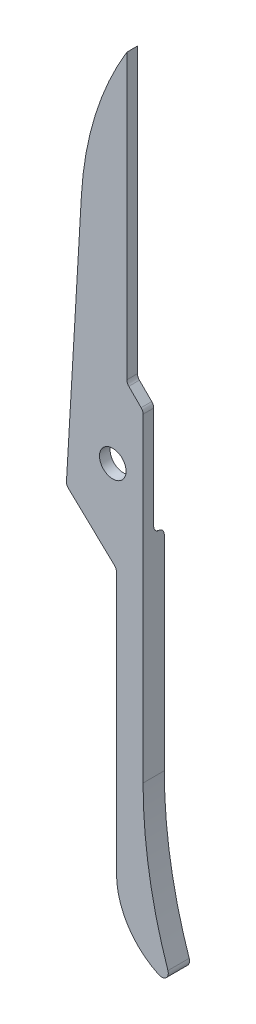
ISO-10303-21;
HEADER;
FILE_DESCRIPTION(('STEP AP214'),'2;1');
FILE_NAME('part.step','',(''),(''),'','','');
FILE_SCHEMA(('AUTOMOTIVE_DESIGN { 1 0 10303 214 1 1 1 1 }'));
ENDSEC;
DATA;
#1=APPLICATION_CONTEXT('core data for automotive mechanical design processes');
#2=APPLICATION_PROTOCOL_DEFINITION('international standard','automotive_design',2000,#1);
#3=PRODUCT_CONTEXT('',#1,'mechanical');
#4=PRODUCT('Part','Part','',(#3));
#5=PRODUCT_RELATED_PRODUCT_CATEGORY('part','',(#4));
#6=PRODUCT_DEFINITION_FORMATION('','',#4);
#7=PRODUCT_DEFINITION_CONTEXT('part definition',#1,'design');
#8=PRODUCT_DEFINITION('design','',#6,#7);
#9=PRODUCT_DEFINITION_SHAPE('','',#8);
#10=(LENGTH_UNIT() NAMED_UNIT(*) SI_UNIT(.MILLI.,.METRE.));
#11=(NAMED_UNIT(*) PLANE_ANGLE_UNIT() SI_UNIT($,.RADIAN.));
#12=(NAMED_UNIT(*) SI_UNIT($,.STERADIAN.) SOLID_ANGLE_UNIT());
#13=UNCERTAINTY_MEASURE_WITH_UNIT(LENGTH_MEASURE(1.E-05),#10,'distance_accuracy_value','');
#14=(GEOMETRIC_REPRESENTATION_CONTEXT(3) GLOBAL_UNCERTAINTY_ASSIGNED_CONTEXT((#13)) GLOBAL_UNIT_ASSIGNED_CONTEXT((#10,
#11,#12)) REPRESENTATION_CONTEXT('',''));
#15=CARTESIAN_POINT('',(0.,0.,0.));
#16=DIRECTION('',(0.,0.,1.));
#17=DIRECTION('',(1.,0.,0.));
#18=AXIS2_PLACEMENT_3D('',#15,#16,#17);
#19=CARTESIAN_POINT('',(4.56,37.74,1.6));
#20=DIRECTION('',(-0.707106781186545,-0.707106781186549,0.));
#21=DIRECTION('',(0.70710678118655,-0.707106781186546,0.));
#22=AXIS2_PLACEMENT_3D('',#19,#20,#21);
#23=PLANE('',#22);
#24=DIRECTION('',(0.70710678118655,-0.707106781186546,0.));
#25=VECTOR('',#24,1.);
#26=CARTESIAN_POINT('',(4.56,37.74,0.8));
#27=LINE('',#26,#25);
#28=CARTESIAN_POINT('',(4.70644660940673,37.5935533905933,0.8));
#29=VERTEX_POINT('',#28);
#30=CARTESIAN_POINT('',(5.63355339059327,36.6664466094067,0.8));
#31=VERTEX_POINT('',#30);
#32=EDGE_CURVE('E240',#29,#31,#27,.T.);
#33=ORIENTED_EDGE('',*,*,#32,.F.);
#34=DIRECTION('',(0.,0.,-1.));
#35=VECTOR('',#34,1.);
#36=CARTESIAN_POINT('',(4.70644660940673,37.5935533905933,1.6));
#37=LINE('',#36,#35);
#38=CARTESIAN_POINT('',(4.70644660940673,37.5935533905933,1.6));
#39=VERTEX_POINT('',#38);
#40=EDGE_CURVE('E327',#29,#39,#37,.F.);
#41=ORIENTED_EDGE('',*,*,#40,.T.);
#42=DIRECTION('',(-0.707106781186549,0.707106781186545,0.));
#43=VECTOR('',#42,1.);
#44=CARTESIAN_POINT('',(4.56,37.74,1.6));
#45=LINE('',#44,#43);
#46=CARTESIAN_POINT('',(5.63355339059327,36.6664466094067,1.6));
#47=VERTEX_POINT('',#46);
#48=EDGE_CURVE('E271',#47,#39,#45,.T.);
#49=ORIENTED_EDGE('',*,*,#48,.F.);
#50=DIRECTION('',(0.,0.,-1.));
#51=VECTOR('',#50,1.);
#52=CARTESIAN_POINT('',(5.63355339059327,36.6664466094067,1.6));
#53=LINE('',#52,#51);
#54=EDGE_CURVE('E323',#47,#31,#53,.T.);
#55=ORIENTED_EDGE('',*,*,#54,.T.);
#56=EDGE_LOOP('',(#33,#41,#49,#55));
#57=FACE_BOUND('',#56,.T.);
#58=ADVANCED_FACE('F39',(#57),#23,.F.);
#59=CARTESIAN_POINT('',(4.56,59.31,1.6));
#60=DIRECTION('',(-1.,0.,0.));
#61=DIRECTION('',(0.,-1.,0.));
#62=AXIS2_PLACEMENT_3D('',#59,#60,#61);
#63=PLANE('',#62);
#64=DIRECTION('',(0.,-1.,0.));
#65=VECTOR('',#64,1.);
#66=CARTESIAN_POINT('',(4.56,59.31,0.8));
#67=LINE('',#66,#65);
#68=CARTESIAN_POINT('',(4.55999999999999,59.31,0.8));
#69=VERTEX_POINT('',#68);
#70=CARTESIAN_POINT('',(4.56,37.9471067811865,0.8));
#71=VERTEX_POINT('',#70);
#72=EDGE_CURVE('E234',#69,#71,#67,.T.);
#73=ORIENTED_EDGE('',*,*,#72,.F.);
#74=DIRECTION('',(0.,0.,-1.));
#75=VECTOR('',#74,1.);
#76=CARTESIAN_POINT('',(4.56,59.31,1.6));
#77=LINE('',#76,#75);
#78=CARTESIAN_POINT('',(4.56,59.31,1.6));
#79=VERTEX_POINT('',#78);
#80=EDGE_CURVE('E311',#79,#69,#77,.T.);
#81=ORIENTED_EDGE('',*,*,#80,.F.);
#82=DIRECTION('',(0.,1.,0.));
#83=VECTOR('',#82,1.);
#84=CARTESIAN_POINT('',(4.56,59.31,1.6));
#85=LINE('',#84,#83);
#86=CARTESIAN_POINT('',(4.56,37.9471067811865,1.6));
#87=VERTEX_POINT('',#86);
#88=EDGE_CURVE('E275',#87,#79,#85,.T.);
#89=ORIENTED_EDGE('',*,*,#88,.F.);
#90=DIRECTION('',(0.,0.,-1.));
#91=VECTOR('',#90,1.);
#92=CARTESIAN_POINT('',(4.56,37.9471067811865,0.));
#93=LINE('',#92,#91);
#94=EDGE_CURVE('E319',#87,#71,#93,.T.);
#95=ORIENTED_EDGE('',*,*,#94,.T.);
#96=EDGE_LOOP('',(#73,#81,#89,#95));
#97=FACE_BOUND('',#96,.T.);
#98=ADVANCED_FACE('F403',(#97),#63,.F.);
#99=CARTESIAN_POINT('',(25.0997203790003,46.895496918826,1.6));
#100=DIRECTION('',(0.,0.,-1.));
#101=DIRECTION('',(-1.,0.,0.));
#102=AXIS2_PLACEMENT_3D('',#99,#100,#101);
#103=CYLINDRICAL_SURFACE('',#102,24.);
#104=CARTESIAN_POINT('',(25.0997203790003,46.895496918826,0.8));
#105=DIRECTION('',(0.,0.,-1.));
#106=DIRECTION('',(-1.,0.,0.));
#107=AXIS2_PLACEMENT_3D('',#104,#105,#106);
#108=CIRCLE('',#107,24.);
#109=CARTESIAN_POINT('',(1.14073152164067,48.2979422592639,0.8));
#110=VERTEX_POINT('',#109);
#111=EDGE_CURVE('E187',#110,#69,#108,.T.);
#112=ORIENTED_EDGE('',*,*,#111,.F.);
#113=DIRECTION('',(0.,0.,-1.));
#114=VECTOR('',#113,1.);
#115=CARTESIAN_POINT('',(1.14073152164067,48.2979422592639,1.6));
#116=LINE('',#115,#114);
#117=CARTESIAN_POINT('',(1.14073152164067,48.2979422592639,1.6));
#118=VERTEX_POINT('',#117);
#119=EDGE_CURVE('E185',#118,#110,#116,.T.);
#120=ORIENTED_EDGE('',*,*,#119,.F.);
#121=CARTESIAN_POINT('',(25.0997203790003,46.895496918826,1.6));
#122=DIRECTION('',(0.,0.,1.));
#123=DIRECTION('',(-1.,0.,0.));
#124=AXIS2_PLACEMENT_3D('',#121,#122,#123);
#125=CIRCLE('',#124,24.);
#126=EDGE_CURVE('E278',#79,#118,#125,.T.);
#127=ORIENTED_EDGE('',*,*,#126,.F.);
#128=ORIENTED_EDGE('',*,*,#80,.T.);
#129=EDGE_LOOP('',(#112,#120,#127,#128));
#130=FACE_BOUND('',#129,.T.);
#131=ADVANCED_FACE('F407',(#130),#103,.T.);
#132=CARTESIAN_POINT('',(0.,28.81,1.6));
#133=DIRECTION('',(0.998291202389986,-0.0584352225182463,0.));
#134=DIRECTION('',(0.0584352225182463,0.998291202389986,0.));
#135=AXIS2_PLACEMENT_3D('',#132,#133,#134);
#136=PLANE('',#135);
#137=DIRECTION('',(0.0584352225182463,0.998291202389986,0.));
#138=VECTOR('',#137,1.);
#139=CARTESIAN_POINT('',(0.,28.81,0.8));
#140=LINE('',#139,#138);
#141=CARTESIAN_POINT('',(0.0136243958831251,29.0427554163716,0.8));
#142=VERTEX_POINT('',#141);
#143=EDGE_CURVE('E165',#142,#110,#140,.T.);
#144=ORIENTED_EDGE('',*,*,#143,.F.);
#145=DIRECTION('',(0.,0.,-1.));
#146=VECTOR('',#145,1.);
#147=CARTESIAN_POINT('',(0.013624395883125,29.0427554163716,1.6));
#148=LINE('',#147,#146);
#149=CARTESIAN_POINT('',(0.013624395883125,29.0427554163716,1.6));
#150=VERTEX_POINT('',#149);
#151=EDGE_CURVE('E182',#142,#150,#148,.F.);
#152=ORIENTED_EDGE('',*,*,#151,.T.);
#153=DIRECTION('',(-0.0584352225182463,-0.998291202389986,0.));
#154=VECTOR('',#153,1.);
#155=CARTESIAN_POINT('',(0.,28.81,1.6));
#156=LINE('',#155,#154);
#157=EDGE_CURVE('E281',#118,#150,#156,.T.);
#158=ORIENTED_EDGE('',*,*,#157,.F.);
#159=ORIENTED_EDGE('',*,*,#119,.T.);
#160=EDGE_LOOP('',(#144,#152,#158,#159));
#161=FACE_BOUND('',#160,.T.);
#162=ADVANCED_FACE('F180',(#161),#136,.F.);
#163=CARTESIAN_POINT('',(3.5,31.95,0.));
#164=DIRECTION('',(0.,0.,1.));
#165=DIRECTION('',(1.,0.,0.));
#166=AXIS2_PLACEMENT_3D('',#163,#164,#165);
#167=CYLINDRICAL_SURFACE('',#166,1.);
#168=CARTESIAN_POINT('',(3.5,31.95,1.6));
#169=DIRECTION('',(0.,0.,1.));
#170=DIRECTION('',(1.,0.,0.));
#171=AXIS2_PLACEMENT_3D('',#168,#169,#170);
#172=CIRCLE('',#171,1.);
#173=CARTESIAN_POINT('',(4.5,31.95,1.6));
#174=VERTEX_POINT('',#173);
#175=EDGE_CURVE('E254',#174,#174,#172,.T.);
#176=ORIENTED_EDGE('',*,*,#175,.T.);
#177=EDGE_LOOP('',(#176));
#178=FACE_BOUND('',#177,.T.);
#179=CARTESIAN_POINT('',(3.5,31.95,0.8));
#180=DIRECTION('',(0.,0.,-1.));
#181=DIRECTION('',(-1.,0.,0.));
#182=AXIS2_PLACEMENT_3D('',#179,#180,#181);
#183=CIRCLE('',#182,1.);
#184=CARTESIAN_POINT('',(2.5,31.95,0.8));
#185=VERTEX_POINT('',#184);
#186=EDGE_CURVE('E250',#185,#185,#183,.F.);
#187=ORIENTED_EDGE('',*,*,#186,.F.);
#188=EDGE_LOOP('',(#187));
#189=FACE_BOUND('',#188,.T.);
#190=ADVANCED_FACE('F414',(#178,#189),#167,.F.);
#191=CARTESIAN_POINT('',(5.06,37.9471067811865,1.6));
#192=DIRECTION('',(0.,0.,1.));
#193=DIRECTION('',(1.,0.,0.));
#194=AXIS2_PLACEMENT_3D('',#191,#192,#193);
#195=CYLINDRICAL_SURFACE('',#194,0.5);
#196=CARTESIAN_POINT('',(5.06,37.9471067811865,0.8));
#197=DIRECTION('',(0.,0.,-1.));
#198=DIRECTION('',(-1.,0.,0.));
#199=AXIS2_PLACEMENT_3D('',#196,#197,#198);
#200=CIRCLE('',#199,0.5);
#201=EDGE_CURVE('E237',#71,#29,#200,.F.);
#202=ORIENTED_EDGE('',*,*,#201,.F.);
#203=ORIENTED_EDGE('',*,*,#94,.F.);
#204=CARTESIAN_POINT('',(5.06,37.9471067811865,1.6));
#205=DIRECTION('',(0.,0.,1.));
#206=DIRECTION('',(1.,0.,0.));
#207=AXIS2_PLACEMENT_3D('',#204,#205,#206);
#208=CIRCLE('',#207,0.5);
#209=EDGE_CURVE('E193',#39,#87,#208,.F.);
#210=ORIENTED_EDGE('',*,*,#209,.F.);
#211=ORIENTED_EDGE('',*,*,#40,.F.);
#212=EDGE_LOOP('',(#202,#203,#210,#211));
#213=FACE_BOUND('',#212,.T.);
#214=ADVANCED_FACE('F400',(#213),#195,.F.);
#215=CARTESIAN_POINT('',(5.28,36.3128932188135,1.6));
#216=DIRECTION('',(0.,0.,-1.));
#217=DIRECTION('',(-1.,0.,0.));
#218=AXIS2_PLACEMENT_3D('',#215,#216,#217);
#219=CYLINDRICAL_SURFACE('',#218,0.5);
#220=DIRECTION('',(0.,0.,-1.));
#221=VECTOR('',#220,1.);
#222=CARTESIAN_POINT('',(5.78,36.3128932188135,1.6));
#223=LINE('',#222,#221);
#224=CARTESIAN_POINT('',(5.78,36.3128932188135,0.8));
#225=VERTEX_POINT('',#224);
#226=CARTESIAN_POINT('',(5.78,36.3128932188135,1.6));
#227=VERTEX_POINT('',#226);
#228=EDGE_CURVE('E333',#225,#227,#223,.F.);
#229=ORIENTED_EDGE('',*,*,#228,.F.);
#230=CARTESIAN_POINT('',(5.28,36.3128932188135,0.8));
#231=DIRECTION('',(0.,0.,-1.));
#232=DIRECTION('',(-1.,0.,0.));
#233=AXIS2_PLACEMENT_3D('',#230,#231,#232);
#234=CIRCLE('',#233,0.5);
#235=EDGE_CURVE('E243',#225,#31,#234,.F.);
#236=ORIENTED_EDGE('',*,*,#235,.T.);
#237=ORIENTED_EDGE('',*,*,#54,.F.);
#238=CARTESIAN_POINT('',(5.28,36.3128932188135,1.6));
#239=DIRECTION('',(0.,0.,1.));
#240=DIRECTION('',(1.,0.,0.));
#241=AXIS2_PLACEMENT_3D('',#238,#239,#240);
#242=CIRCLE('',#241,0.5);
#243=EDGE_CURVE('E341',#227,#47,#242,.T.);
#244=ORIENTED_EDGE('',*,*,#243,.F.);
#245=EDGE_LOOP('',(#229,#236,#237,#244));
#246=FACE_BOUND('',#245,.T.);
#247=ADVANCED_FACE('F391',(#246),#219,.T.);
#248=CARTESIAN_POINT('',(0.512769997078118,29.0135378051125,1.6));
#249=DIRECTION('',(0.,0.,-1.));
#250=DIRECTION('',(-1.,0.,0.));
#251=AXIS2_PLACEMENT_3D('',#248,#249,#250);
#252=CYLINDRICAL_SURFACE('',#251,0.5);
#253=ORIENTED_EDGE('',*,*,#151,.F.);
#254=CARTESIAN_POINT('',(0.512769997078118,29.0135378051125,0.8));
#255=DIRECTION('',(0.,0.,-1.));
#256=DIRECTION('',(-1.,0.,0.));
#257=AXIS2_PLACEMENT_3D('',#254,#255,#256);
#258=CIRCLE('',#257,0.5);
#259=CARTESIAN_POINT('',(0.169543400454176,28.6499508095118,0.8));
#260=VERTEX_POINT('',#259);
#261=EDGE_CURVE('E160',#142,#260,#258,.F.);
#262=ORIENTED_EDGE('',*,*,#261,.T.);
#263=DIRECTION('',(0.,0.,-1.));
#264=VECTOR('',#263,1.);
#265=CARTESIAN_POINT('',(0.169543400454176,28.6499508095118,1.6));
#266=LINE('',#265,#264);
#267=CARTESIAN_POINT('',(0.169543400454177,28.6499508095118,1.6));
#268=VERTEX_POINT('',#267);
#269=EDGE_CURVE('E200',#268,#260,#266,.T.);
#270=ORIENTED_EDGE('',*,*,#269,.F.);
#271=CARTESIAN_POINT('',(0.512769997078118,29.0135378051125,1.6));
#272=DIRECTION('',(0.,0.,1.));
#273=DIRECTION('',(1.,0.,0.));
#274=AXIS2_PLACEMENT_3D('',#271,#272,#273);
#275=CIRCLE('',#274,0.5);
#276=EDGE_CURVE('E191',#150,#268,#275,.T.);
#277=ORIENTED_EDGE('',*,*,#276,.F.);
#278=EDGE_LOOP('',(#253,#262,#270,#277));
#279=FACE_BOUND('',#278,.T.);
#280=ADVANCED_FACE('F190',(#279),#252,.T.);
#281=CARTESIAN_POINT('',(9.28,5.34898121140839,1.6));
#282=DIRECTION('',(0.,0.,-1.));
#283=DIRECTION('',(-1.,0.,0.));
#284=AXIS2_PLACEMENT_3D('',#281,#282,#283);
#285=CYLINDRICAL_SURFACE('',#284,5.5);
#286=CARTESIAN_POINT('',(9.28,5.34898121140839,0.));
#287=DIRECTION('',(0.,0.,1.));
#288=DIRECTION('',(1.,0.,0.));
#289=AXIS2_PLACEMENT_3D('',#286,#287,#288);
#290=CIRCLE('',#289,5.5);
#291=CARTESIAN_POINT('',(3.78,5.34898121140839,0.));
#292=VERTEX_POINT('',#291);
#293=CARTESIAN_POINT('',(6.96872675258759,0.358188090491067,0.));
#294=VERTEX_POINT('',#293);
#295=EDGE_CURVE('E258',#292,#294,#290,.T.);
#296=ORIENTED_EDGE('',*,*,#295,.T.);
#297=DIRECTION('',(0.,0.,-1.));
#298=VECTOR('',#297,1.);
#299=CARTESIAN_POINT('',(6.96872675258759,0.358188090491067,1.6));
#300=LINE('',#299,#298);
#301=CARTESIAN_POINT('',(6.96872675258759,0.358188090491067,1.6));
#302=VERTEX_POINT('',#301);
#303=EDGE_CURVE('E348',#294,#302,#300,.F.);
#304=ORIENTED_EDGE('',*,*,#303,.T.);
#305=CARTESIAN_POINT('',(9.28,5.34898121140839,1.6));
#306=DIRECTION('',(0.,0.,1.));
#307=DIRECTION('',(1.,0.,0.));
#308=AXIS2_PLACEMENT_3D('',#305,#306,#307);
#309=CIRCLE('',#308,5.5);
#310=CARTESIAN_POINT('',(3.78,5.34898121140839,1.6));
#311=VERTEX_POINT('',#310);
#312=EDGE_CURVE('E259',#311,#302,#309,.T.);
#313=ORIENTED_EDGE('',*,*,#312,.F.);
#314=DIRECTION('',(0.,0.,-1.));
#315=VECTOR('',#314,1.);
#316=CARTESIAN_POINT('',(3.78,5.34898121140839,1.6));
#317=LINE('',#316,#315);
#318=EDGE_CURVE('E291',#311,#292,#317,.T.);
#319=ORIENTED_EDGE('',*,*,#318,.T.);
#320=EDGE_LOOP('',(#296,#304,#313,#319));
#321=FACE_BOUND('',#320,.T.);
#322=ADVANCED_FACE('F373',(#321),#285,.T.);
#323=CARTESIAN_POINT('',(40.78,12.2666865941867,1.6));
#324=DIRECTION('',(0.,0.,-1.));
#325=DIRECTION('',(-1.,0.,0.));
#326=AXIS2_PLACEMENT_3D('',#323,#324,#325);
#327=CYLINDRICAL_SURFACE('',#326,35.);
#328=CARTESIAN_POINT('',(40.78,12.2666865941867,1.6));
#329=DIRECTION('',(0.,0.,-1.));
#330=DIRECTION('',(1.,0.,0.));
#331=AXIS2_PLACEMENT_3D('',#328,#329,#330);
#332=CIRCLE('',#331,35.);
#333=CARTESIAN_POINT('',(7.65209824175584,0.973231626988967,1.6));
#334=VERTEX_POINT('',#333);
#335=CARTESIAN_POINT('',(5.78000000000001,12.2666865941867,1.6));
#336=VERTEX_POINT('',#335);
#337=EDGE_CURVE('E263',#334,#336,#332,.T.);
#338=ORIENTED_EDGE('',*,*,#337,.F.);
#339=DIRECTION('',(0.,0.,-1.));
#340=VECTOR('',#339,1.);
#341=CARTESIAN_POINT('',(7.65209824175583,0.973231626988966,1.6));
#342=LINE('',#341,#340);
#343=CARTESIAN_POINT('',(7.65209824175584,0.973231626988967,0.));
#344=VERTEX_POINT('',#343);
#345=EDGE_CURVE('E344',#334,#344,#342,.T.);
#346=ORIENTED_EDGE('',*,*,#345,.T.);
#347=CARTESIAN_POINT('',(40.78,12.2666865941867,0.));
#348=DIRECTION('',(0.,0.,-1.));
#349=DIRECTION('',(1.,0.,0.));
#350=AXIS2_PLACEMENT_3D('',#347,#348,#349);
#351=CIRCLE('',#350,35.);
#352=CARTESIAN_POINT('',(5.78000000000001,12.2666865941867,0.));
#353=VERTEX_POINT('',#352);
#354=EDGE_CURVE('E295',#344,#353,#351,.T.);
#355=ORIENTED_EDGE('',*,*,#354,.T.);
#356=DIRECTION('',(0.,0.,-1.));
#357=VECTOR('',#356,1.);
#358=CARTESIAN_POINT('',(5.78000000000001,12.2666865941867,1.6));
#359=LINE('',#358,#357);
#360=EDGE_CURVE('E315',#336,#353,#359,.T.);
#361=ORIENTED_EDGE('',*,*,#360,.F.);
#362=EDGE_LOOP('',(#338,#346,#355,#361));
#363=FACE_BOUND('',#362,.T.);
#364=ADVANCED_FACE('F382',(#363),#327,.F.);
#365=CARTESIAN_POINT('',(5.78,36.52,1.6));
#366=DIRECTION('',(-1.,0.,0.));
#367=DIRECTION('',(0.,0.,1.));
#368=AXIS2_PLACEMENT_3D('',#365,#366,#367);
#369=PLANE('',#368);
#370=DIRECTION('',(0.,1.,0.));
#371=VECTOR('',#370,1.);
#372=CARTESIAN_POINT('',(5.78,36.52,0.));
#373=LINE('',#372,#371);
#374=CARTESIAN_POINT('',(5.78,27.6413104323413,0.));
#375=VERTEX_POINT('',#374);
#376=EDGE_CURVE('E298',#353,#375,#373,.T.);
#377=ORIENTED_EDGE('',*,*,#376,.T.);
#378=CARTESIAN_POINT('',(5.78,27.6413104323413,0.4));
#379=DIRECTION('',(-1.,0.,0.));
#380=DIRECTION('',(0.,-1.,0.));
#381=AXIS2_PLACEMENT_3D('',#378,#379,#380);
#382=ELLIPSE('',#381,0.498439148682849,0.4);
#383=CARTESIAN_POINT('',(5.78,28.1397495810242,0.4));
#384=VERTEX_POINT('',#383);
#385=EDGE_CURVE('E55',#375,#384,#382,.F.);
#386=ORIENTED_EDGE('',*,*,#385,.T.);
#387=CARTESIAN_POINT('',(5.78,28.638188729707,0.4));
#388=DIRECTION('',(-1.,0.,0.));
#389=DIRECTION('',(0.,-1.,0.));
#390=AXIS2_PLACEMENT_3D('',#387,#388,#389);
#391=ELLIPSE('',#390,0.498439148682849,0.4);
#392=CARTESIAN_POINT('',(5.78,28.638188729707,0.8));
#393=VERTEX_POINT('',#392);
#394=EDGE_CURVE('E11',#384,#393,#391,.T.);
#395=ORIENTED_EDGE('',*,*,#394,.T.);
#396=DIRECTION('',(0.,-1.,0.));
#397=VECTOR('',#396,1.);
#398=CARTESIAN_POINT('',(5.78,36.52,0.8));
#399=LINE('',#398,#397);
#400=EDGE_CURVE('E247',#225,#393,#399,.T.);
#401=ORIENTED_EDGE('',*,*,#400,.F.);
#402=ORIENTED_EDGE('',*,*,#228,.T.);
#403=DIRECTION('',(0.,1.,0.));
#404=VECTOR('',#403,1.);
#405=CARTESIAN_POINT('',(5.78,36.52,1.6));
#406=LINE('',#405,#404);
#407=EDGE_CURVE('E267',#336,#227,#406,.T.);
#408=ORIENTED_EDGE('',*,*,#407,.F.);
#409=ORIENTED_EDGE('',*,*,#360,.T.);
#410=EDGE_LOOP('',(#377,#386,#395,#401,#402,#408,#409));
#411=FACE_BOUND('',#410,.T.);
#412=ADVANCED_FACE('F384',(#411),#369,.F.);
#413=CARTESIAN_POINT('',(3.78,25.2416750848171,1.6));
#414=DIRECTION('',(0.686453193247883,0.727173991201408,0.));
#415=DIRECTION('',(-0.727173991201408,0.686453193247883,0.));
#416=AXIS2_PLACEMENT_3D('',#413,#414,#415);
#417=PLANE('',#416);
#418=DIRECTION('',(-0.727173991201408,0.686453193247883,0.));
#419=VECTOR('',#418,1.);
#420=CARTESIAN_POINT('',(3.78,25.2416750848171,0.8));
#421=LINE('',#420,#419);
#422=CARTESIAN_POINT('',(2.64839686472933,26.3099099159508,0.8));
#423=VERTEX_POINT('',#422);
#424=EDGE_CURVE('E169',#423,#260,#421,.T.);
#425=ORIENTED_EDGE('',*,*,#424,.F.);
#426=CARTESIAN_POINT('',(2.64839686472933,26.3099099159508,0.4));
#427=DIRECTION('',(0.686453193247883,0.727173991201408,0.));
#428=DIRECTION('',(-0.727173991201408,0.686453193247883,0.));
#429=AXIS2_PLACEMENT_3D('',#426,#427,#428);
#430=ELLIPSE('',#429,0.406195670733478,0.4);
#431=CARTESIAN_POINT('',(2.94377179182533,26.0310756006923,0.4));
#432=VERTEX_POINT('',#431);
#433=EDGE_CURVE('E49',#423,#432,#430,.T.);
#434=ORIENTED_EDGE('',*,*,#433,.T.);
#435=CARTESIAN_POINT('',(3.23914671892132,25.7522412854339,0.4));
#436=DIRECTION('',(0.686453193247883,0.727173991201408,0.));
#437=DIRECTION('',(-0.727173991201408,0.686453193247883,0.));
#438=AXIS2_PLACEMENT_3D('',#435,#436,#437);
#439=ELLIPSE('',#438,0.406195670733478,0.4);
#440=CARTESIAN_POINT('',(3.23914671892132,25.7522412854339,0.));
#441=VERTEX_POINT('',#440);
#442=EDGE_CURVE('E211',#432,#441,#439,.F.);
#443=ORIENTED_EDGE('',*,*,#442,.T.);
#444=DIRECTION('',(0.727173991201408,-0.686453193247883,0.));
#445=VECTOR('',#444,1.);
#446=CARTESIAN_POINT('',(3.78,25.2416750848171,0.));
#447=LINE('',#446,#445);
#448=CARTESIAN_POINT('',(3.62322659662395,25.3896693814585,0.));
#449=VERTEX_POINT('',#448);
#450=EDGE_CURVE('E301',#441,#449,#447,.T.);
#451=ORIENTED_EDGE('',*,*,#450,.T.);
#452=DIRECTION('',(0.,0.,-1.));
#453=VECTOR('',#452,1.);
#454=CARTESIAN_POINT('',(3.62322659662395,25.3896693814585,1.6));
#455=LINE('',#454,#453);
#456=CARTESIAN_POINT('',(3.62322659662395,25.3896693814585,1.6));
#457=VERTEX_POINT('',#456);
#458=EDGE_CURVE('E194',#449,#457,#455,.F.);
#459=ORIENTED_EDGE('',*,*,#458,.T.);
#460=DIRECTION('',(0.727173991201408,-0.686453193247883,0.));
#461=VECTOR('',#460,1.);
#462=CARTESIAN_POINT('',(3.78,25.2416750848171,1.6));
#463=LINE('',#462,#461);
#464=EDGE_CURVE('E284',#268,#457,#463,.T.);
#465=ORIENTED_EDGE('',*,*,#464,.F.);
#466=ORIENTED_EDGE('',*,*,#269,.T.);
#467=EDGE_LOOP('',(#425,#434,#443,#451,#459,#465,#466));
#468=FACE_BOUND('',#467,.T.);
#469=ADVANCED_FACE('F221',(#468),#417,.F.);
#470=CARTESIAN_POINT('',(3.78,5.34898121140839,1.6));
#471=DIRECTION('',(1.,0.,0.));
#472=DIRECTION('',(0.,1.,0.));
#473=AXIS2_PLACEMENT_3D('',#470,#471,#472);
#474=PLANE('',#473);
#475=DIRECTION('',(0.,-1.,0.));
#476=VECTOR('',#475,1.);
#477=CARTESIAN_POINT('',(3.78,5.34898121140839,1.6));
#478=LINE('',#477,#476);
#479=CARTESIAN_POINT('',(3.78,25.0260823858578,1.6));
#480=VERTEX_POINT('',#479);
#481=EDGE_CURVE('E288',#480,#311,#478,.T.);
#482=ORIENTED_EDGE('',*,*,#481,.F.);
#483=DIRECTION('',(0.,0.,-1.));
#484=VECTOR('',#483,1.);
#485=CARTESIAN_POINT('',(3.78,25.0260823858578,0.));
#486=LINE('',#485,#484);
#487=CARTESIAN_POINT('',(3.78,25.0260823858578,0.));
#488=VERTEX_POINT('',#487);
#489=EDGE_CURVE('E351',#480,#488,#486,.T.);
#490=ORIENTED_EDGE('',*,*,#489,.T.);
#491=DIRECTION('',(0.,-1.,0.));
#492=VECTOR('',#491,1.);
#493=CARTESIAN_POINT('',(3.78,5.34898121140839,0.));
#494=LINE('',#493,#492);
#495=EDGE_CURVE('E264',#488,#292,#494,.T.);
#496=ORIENTED_EDGE('',*,*,#495,.T.);
#497=ORIENTED_EDGE('',*,*,#318,.F.);
#498=EDGE_LOOP('',(#482,#490,#496,#497));
#499=FACE_BOUND('',#498,.T.);
#500=ADVANCED_FACE('F366',(#499),#474,.F.);
#501=CARTESIAN_POINT('',(9.28,5.34898121140839,1.6));
#502=DIRECTION('',(0.,0.,1.));
#503=DIRECTION('',(1.,0.,0.));
#504=AXIS2_PLACEMENT_3D('',#501,#502,#503);
#505=PLANE('',#504);
#506=ORIENTED_EDGE('',*,*,#175,.F.);
#507=EDGE_LOOP('',(#506));
#508=FACE_BOUND('',#507,.T.);
#509=ORIENTED_EDGE('',*,*,#407,.T.);
#510=ORIENTED_EDGE('',*,*,#243,.T.);
#511=ORIENTED_EDGE('',*,*,#48,.T.);
#512=ORIENTED_EDGE('',*,*,#209,.T.);
#513=ORIENTED_EDGE('',*,*,#88,.T.);
#514=ORIENTED_EDGE('',*,*,#126,.T.);
#515=ORIENTED_EDGE('',*,*,#157,.T.);
#516=ORIENTED_EDGE('',*,*,#276,.T.);
#517=ORIENTED_EDGE('',*,*,#464,.T.);
#518=CARTESIAN_POINT('',(3.28,25.0260823858578,1.6));
#519=DIRECTION('',(0.,0.,1.));
#520=DIRECTION('',(1.,0.,0.));
#521=AXIS2_PLACEMENT_3D('',#518,#519,#520);
#522=CIRCLE('',#521,0.5);
#523=EDGE_CURVE('E176',#457,#480,#522,.F.);
#524=ORIENTED_EDGE('',*,*,#523,.T.);
#525=ORIENTED_EDGE('',*,*,#481,.T.);
#526=ORIENTED_EDGE('',*,*,#312,.T.);
#527=CARTESIAN_POINT('',(7.17884250235236,0.811896556029002,1.6));
#528=DIRECTION('',(0.,0.,1.));
#529=DIRECTION('',(1.,0.,0.));
#530=AXIS2_PLACEMENT_3D('',#527,#528,#529);
#531=CIRCLE('',#530,0.5);
#532=EDGE_CURVE('E338',#302,#334,#531,.T.);
#533=ORIENTED_EDGE('',*,*,#532,.T.);
#534=ORIENTED_EDGE('',*,*,#337,.T.);
#535=EDGE_LOOP('',(#509,#510,#511,#512,#513,#514,#515,#516,#517,#524,#525,#526,#533,#534));
#536=FACE_BOUND('',#535,.T.);
#537=ADVANCED_FACE('F359',(#508,#536),#505,.T.);
#538=CARTESIAN_POINT('',(9.28,5.34898121140839,0.));
#539=DIRECTION('',(0.,0.,1.));
#540=DIRECTION('',(1.,0.,0.));
#541=AXIS2_PLACEMENT_3D('',#538,#539,#540);
#542=PLANE('',#541);
#543=ORIENTED_EDGE('',*,*,#450,.F.);
#544=DIRECTION('',(-0.802505182542383,-0.596645147464233,0.));
#545=VECTOR('',#544,1.);
#546=CARTESIAN_POINT('',(-2.63975751236367,21.3814038649317,0.));
#547=LINE('',#546,#545);
#548=EDGE_CURVE('E63',#441,#375,#547,.F.);
#549=ORIENTED_EDGE('',*,*,#548,.T.);
#550=ORIENTED_EDGE('',*,*,#376,.F.);
#551=ORIENTED_EDGE('',*,*,#354,.F.);
#552=CARTESIAN_POINT('',(7.17884250235236,0.811896556029002,0.));
#553=DIRECTION('',(0.,0.,1.));
#554=DIRECTION('',(1.,0.,0.));
#555=AXIS2_PLACEMENT_3D('',#552,#553,#554);
#556=CIRCLE('',#555,0.5);
#557=EDGE_CURVE('E330',#344,#294,#556,.F.);
#558=ORIENTED_EDGE('',*,*,#557,.T.);
#559=ORIENTED_EDGE('',*,*,#295,.F.);
#560=ORIENTED_EDGE('',*,*,#495,.F.);
#561=CARTESIAN_POINT('',(3.28,25.0260823858578,0.));
#562=DIRECTION('',(0.,0.,1.));
#563=DIRECTION('',(1.,0.,0.));
#564=AXIS2_PLACEMENT_3D('',#561,#562,#563);
#565=CIRCLE('',#564,0.5);
#566=EDGE_CURVE('E198',#488,#449,#565,.T.);
#567=ORIENTED_EDGE('',*,*,#566,.T.);
#568=EDGE_LOOP('',(#543,#549,#550,#551,#558,#559,#560,#567));
#569=FACE_BOUND('',#568,.T.);
#570=ADVANCED_FACE('F369',(#569),#542,.F.);
#571=CARTESIAN_POINT('',(7.17884250235236,0.811896556029002,1.6));
#572=DIRECTION('',(0.,0.,1.));
#573=DIRECTION('',(1.,0.,0.));
#574=AXIS2_PLACEMENT_3D('',#571,#572,#573);
#575=CYLINDRICAL_SURFACE('',#574,0.5);
#576=ORIENTED_EDGE('',*,*,#532,.F.);
#577=ORIENTED_EDGE('',*,*,#303,.F.);
#578=ORIENTED_EDGE('',*,*,#557,.F.);
#579=ORIENTED_EDGE('',*,*,#345,.F.);
#580=EDGE_LOOP('',(#576,#577,#578,#579));
#581=FACE_BOUND('',#580,.T.);
#582=ADVANCED_FACE('F377',(#581),#575,.T.);
#583=CARTESIAN_POINT('',(3.28,25.0260823858578,1.6));
#584=DIRECTION('',(0.,0.,1.));
#585=DIRECTION('',(1.,0.,0.));
#586=AXIS2_PLACEMENT_3D('',#583,#584,#585);
#587=CYLINDRICAL_SURFACE('',#586,0.5);
#588=ORIENTED_EDGE('',*,*,#523,.F.);
#589=ORIENTED_EDGE('',*,*,#458,.F.);
#590=ORIENTED_EDGE('',*,*,#566,.F.);
#591=ORIENTED_EDGE('',*,*,#489,.F.);
#592=EDGE_LOOP('',(#588,#589,#590,#591));
#593=FACE_BOUND('',#592,.T.);
#594=ADVANCED_FACE('F363',(#593),#587,.F.);
#595=CARTESIAN_POINT('',(0.,0.,0.8));
#596=DIRECTION('',(0.,0.,-1.));
#597=DIRECTION('',(-1.,0.,0.));
#598=AXIS2_PLACEMENT_3D('',#595,#596,#597);
#599=PLANE('',#598);
#600=ORIENTED_EDGE('',*,*,#400,.T.);
#601=DIRECTION('',(-0.802505182542383,-0.596645147464233,0.));
#602=VECTOR('',#601,1.);
#603=CARTESIAN_POINT('',(-11.6546789173762,15.6758841864587,0.8));
#604=LINE('',#603,#602);
#605=EDGE_CURVE('E175',#393,#423,#604,.T.);
#606=ORIENTED_EDGE('',*,*,#605,.T.);
#607=ORIENTED_EDGE('',*,*,#424,.T.);
#608=ORIENTED_EDGE('',*,*,#261,.F.);
#609=ORIENTED_EDGE('',*,*,#143,.T.);
#610=ORIENTED_EDGE('',*,*,#111,.T.);
#611=ORIENTED_EDGE('',*,*,#72,.T.);
#612=ORIENTED_EDGE('',*,*,#201,.T.);
#613=ORIENTED_EDGE('',*,*,#32,.T.);
#614=ORIENTED_EDGE('',*,*,#235,.F.);
#615=EDGE_LOOP('',(#600,#606,#607,#608,#609,#610,#611,#612,#613,#614));
#616=FACE_BOUND('',#615,.T.);
#617=ORIENTED_EDGE('',*,*,#186,.T.);
#618=EDGE_LOOP('',(#617));
#619=FACE_BOUND('',#618,.T.);
#620=ADVANCED_FACE('F163',(#616,#619),#599,.T.);
#621=CARTESIAN_POINT('',(14.6136786871096,34.2089583897348,0.4));
#622=DIRECTION('',(-0.802505182542383,-0.596645147464233,0.));
#623=DIRECTION('',(0.596645147464233,-0.802505182542383,0.));
#624=AXIS2_PLACEMENT_3D('',#621,#622,#623);
#625=CYLINDRICAL_SURFACE('',#624,0.4);
#626=DIRECTION('',(-0.802505182542383,-0.596645147464233,0.));
#627=VECTOR('',#626,1.);
#628=CARTESIAN_POINT('',(14.3750206281239,34.5299604627518,0.4));
#629=LINE('',#628,#627);
#630=EDGE_CURVE('E43',#384,#432,#629,.T.);
#631=ORIENTED_EDGE('',*,*,#630,.F.);
#632=ORIENTED_EDGE('',*,*,#385,.F.);
#633=ORIENTED_EDGE('',*,*,#548,.F.);
#634=ORIENTED_EDGE('',*,*,#442,.F.);
#635=EDGE_LOOP('',(#631,#632,#633,#634));
#636=FACE_BOUND('',#635,.T.);
#637=ADVANCED_FACE('F41',(#636),#625,.T.);
#638=CARTESIAN_POINT('',(-11.6546789173762,15.6758841864587,0.4));
#639=DIRECTION('',(-0.802505182542383,-0.596645147464233,0.));
#640=DIRECTION('',(0.596645147464233,-0.802505182542383,0.));
#641=AXIS2_PLACEMENT_3D('',#638,#639,#640);
#642=CYLINDRICAL_SURFACE('',#641,0.4);
#643=ORIENTED_EDGE('',*,*,#394,.F.);
#644=ORIENTED_EDGE('',*,*,#630,.T.);
#645=ORIENTED_EDGE('',*,*,#433,.F.);
#646=ORIENTED_EDGE('',*,*,#605,.F.);
#647=EDGE_LOOP('',(#643,#644,#645,#646));
#648=FACE_BOUND('',#647,.T.);
#649=ADVANCED_FACE('F227',(#648),#642,.F.);
#650=CLOSED_SHELL('',(#58,#98,#131,#162,#190,#214,#247,#280,#322,#364,#412,#469,#500,#537,#570,
#582,#594,#620,#637,#649));
#651=MANIFOLD_SOLID_BREP('B2',#650);
#652=ADVANCED_BREP_SHAPE_REPRESENTATION('',(#18,#651),#14);
#653=SHAPE_DEFINITION_REPRESENTATION(#9,#652);
ENDSEC;
END-ISO-10303-21;
